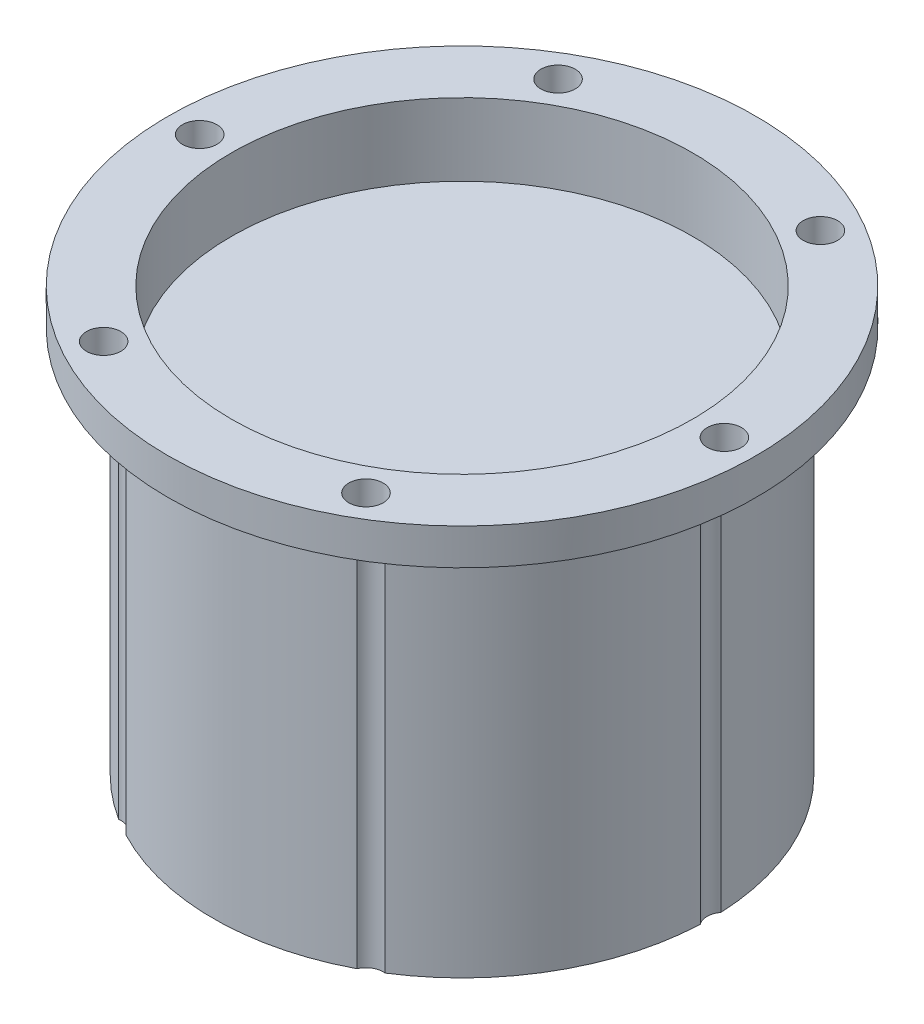
ISO-10303-21;
HEADER;
FILE_DESCRIPTION(('STEP AP214'),'2;1');
FILE_NAME('part.step','',(''),(''),'','','');
FILE_SCHEMA(('AUTOMOTIVE_DESIGN { 1 0 10303 214 1 1 1 1 }'));
ENDSEC;
DATA;
#1=APPLICATION_CONTEXT('core data for automotive mechanical design processes');
#2=APPLICATION_PROTOCOL_DEFINITION('international standard','automotive_design',2000,#1);
#3=PRODUCT_CONTEXT('',#1,'mechanical');
#4=PRODUCT('Part','Part','',(#3));
#5=PRODUCT_RELATED_PRODUCT_CATEGORY('part','',(#4));
#6=PRODUCT_DEFINITION_FORMATION('','',#4);
#7=PRODUCT_DEFINITION_CONTEXT('part definition',#1,'design');
#8=PRODUCT_DEFINITION('design','',#6,#7);
#9=PRODUCT_DEFINITION_SHAPE('','',#8);
#10=(LENGTH_UNIT() NAMED_UNIT(*) SI_UNIT(.MILLI.,.METRE.));
#11=(NAMED_UNIT(*) PLANE_ANGLE_UNIT() SI_UNIT($,.RADIAN.));
#12=(NAMED_UNIT(*) SI_UNIT($,.STERADIAN.) SOLID_ANGLE_UNIT());
#13=UNCERTAINTY_MEASURE_WITH_UNIT(LENGTH_MEASURE(1.E-05),#10,'distance_accuracy_value','');
#14=(GEOMETRIC_REPRESENTATION_CONTEXT(3) GLOBAL_UNCERTAINTY_ASSIGNED_CONTEXT((#13)) GLOBAL_UNIT_ASSIGNED_CONTEXT((#10,
#11,#12)) REPRESENTATION_CONTEXT('',''));
#15=CARTESIAN_POINT('',(0.,0.,0.));
#16=DIRECTION('',(0.,0.,1.));
#17=DIRECTION('',(1.,0.,0.));
#18=AXIS2_PLACEMENT_3D('',#15,#16,#17);
#19=CARTESIAN_POINT('',(0.,-5.07999999999999,0.));
#20=DIRECTION('',(0.,-1.,0.));
#21=DIRECTION('',(0.,0.,-1.));
#22=AXIS2_PLACEMENT_3D('',#19,#20,#21);
#23=CYLINDRICAL_SURFACE('',#22,34.925);
#24=DIRECTION('',(0.,-1.,0.));
#25=VECTOR('',#24,1.);
#26=CARTESIAN_POINT('',(-18.6963691346654,-32.258,29.4991763644399));
#27=LINE('',#26,#25);
#28=CARTESIAN_POINT('',(-18.6963691346653,-59.436,29.49917636444));
#29=VERTEX_POINT('',#28);
#30=CARTESIAN_POINT('',(-18.6963691346653,-5.07999999999999,29.49917636444));
#31=VERTEX_POINT('',#30);
#32=EDGE_CURVE('E55',#29,#31,#27,.F.);
#33=ORIENTED_EDGE('',*,*,#32,.T.);
#34=CARTESIAN_POINT('',(0.,-5.07999999999999,0.));
#35=DIRECTION('',(0.,-1.,0.));
#36=DIRECTION('',(0.,0.,-1.));
#37=AXIS2_PLACEMENT_3D('',#34,#35,#36);
#38=CIRCLE('',#37,34.925);
#39=CARTESIAN_POINT('',(-34.8952206896552,-5.07999999999999,1.44194244693113));
#40=VERTEX_POINT('',#39);
#41=EDGE_CURVE('E164',#31,#40,#38,.T.);
#42=ORIENTED_EDGE('',*,*,#41,.T.);
#43=DIRECTION('',(0.,-1.,0.));
#44=VECTOR('',#43,1.);
#45=CARTESIAN_POINT('',(-34.8952206896552,-32.258,1.44194244693111));
#46=LINE('',#45,#44);
#47=CARTESIAN_POINT('',(-34.8952206896552,-59.436,1.44194244693106));
#48=VERTEX_POINT('',#47);
#49=EDGE_CURVE('E281',#40,#48,#46,.T.);
#50=ORIENTED_EDGE('',*,*,#49,.T.);
#51=CARTESIAN_POINT('',(0.,-59.436,0.));
#52=DIRECTION('',(0.,-1.,0.));
#53=DIRECTION('',(0.,0.,-1.));
#54=AXIS2_PLACEMENT_3D('',#51,#52,#53);
#55=CIRCLE('',#54,34.925);
#56=EDGE_CURVE('E165',#29,#48,#55,.T.);
#57=ORIENTED_EDGE('',*,*,#56,.F.);
#58=EDGE_LOOP('',(#33,#42,#50,#57));
#59=FACE_BOUND('',#58,.T.);
#60=ADVANCED_FACE('F39',(#59),#23,.T.);
#61=DIRECTION('',(0.,-1.,0.));
#62=VECTOR('',#61,1.);
#63=CARTESIAN_POINT('',(-16.1988515549905,-32.258,30.9411188113711));
#64=LINE('',#63,#62);
#65=CARTESIAN_POINT('',(-16.1988515549905,-5.07999999999999,30.9411188113711));
#66=VERTEX_POINT('',#65);
#67=CARTESIAN_POINT('',(-16.1988515549906,-59.436,30.9411188113711));
#68=VERTEX_POINT('',#67);
#69=EDGE_CURVE('E250',#66,#68,#64,.T.);
#70=ORIENTED_EDGE('',*,*,#69,.T.);
#71=CARTESIAN_POINT('',(16.1988515549899,-59.436,30.9411188113714));
#72=VERTEX_POINT('',#71);
#73=EDGE_CURVE('E290',#72,#68,#55,.T.);
#74=ORIENTED_EDGE('',*,*,#73,.F.);
#75=DIRECTION('',(0.,-1.,0.));
#76=VECTOR('',#75,1.);
#77=CARTESIAN_POINT('',(16.1988515549899,-32.258,30.9411188113714));
#78=LINE('',#77,#76);
#79=CARTESIAN_POINT('',(16.1988515549899,-5.07999999999999,30.9411188113714));
#80=VERTEX_POINT('',#79);
#81=EDGE_CURVE('E63',#72,#80,#78,.F.);
#82=ORIENTED_EDGE('',*,*,#81,.T.);
#83=EDGE_CURVE('E183',#80,#66,#38,.T.);
#84=ORIENTED_EDGE('',*,*,#83,.T.);
#85=EDGE_LOOP('',(#70,#74,#82,#84));
#86=FACE_BOUND('',#85,.T.);
#87=ADVANCED_FACE('F332',(#86),#23,.T.);
#88=DIRECTION('',(0.,-1.,0.));
#89=VECTOR('',#88,1.);
#90=CARTESIAN_POINT('',(18.6963691346647,-32.258,29.4991763644403));
#91=LINE('',#90,#89);
#92=CARTESIAN_POINT('',(18.6963691346647,-5.07999999999999,29.4991763644403));
#93=VERTEX_POINT('',#92);
#94=CARTESIAN_POINT('',(18.6963691346647,-59.436,29.4991763644404));
#95=VERTEX_POINT('',#94);
#96=EDGE_CURVE('E233',#93,#95,#91,.T.);
#97=ORIENTED_EDGE('',*,*,#96,.T.);
#98=CARTESIAN_POINT('',(34.8952206896552,-59.436,1.44194244693108));
#99=VERTEX_POINT('',#98);
#100=EDGE_CURVE('E166',#99,#95,#55,.T.);
#101=ORIENTED_EDGE('',*,*,#100,.F.);
#102=DIRECTION('',(0.,-1.,0.));
#103=VECTOR('',#102,1.);
#104=CARTESIAN_POINT('',(34.8952206896552,-32.258,1.44194244693111));
#105=LINE('',#104,#103);
#106=CARTESIAN_POINT('',(34.8952206896552,-5.07999999999999,1.4419424469311));
#107=VERTEX_POINT('',#106);
#108=EDGE_CURVE('E216',#99,#107,#105,.F.);
#109=ORIENTED_EDGE('',*,*,#108,.T.);
#110=EDGE_CURVE('E190',#107,#93,#38,.T.);
#111=ORIENTED_EDGE('',*,*,#110,.T.);
#112=EDGE_LOOP('',(#97,#101,#109,#111));
#113=FACE_BOUND('',#112,.T.);
#114=ADVANCED_FACE('F300',(#113),#23,.T.);
#115=DIRECTION('',(0.,-1.,0.));
#116=VECTOR('',#115,1.);
#117=CARTESIAN_POINT('',(34.8952206896552,-32.258,-1.44194244693111));
#118=LINE('',#117,#116);
#119=CARTESIAN_POINT('',(34.8952206896552,-5.07999999999999,-1.44194244693111));
#120=VERTEX_POINT('',#119);
#121=CARTESIAN_POINT('',(34.8952206896552,-59.436,-1.44194244693106));
#122=VERTEX_POINT('',#121);
#123=EDGE_CURVE('E206',#120,#122,#118,.T.);
#124=ORIENTED_EDGE('',*,*,#123,.T.);
#125=CARTESIAN_POINT('',(18.6963691346651,-59.436,-29.4991763644401));
#126=VERTEX_POINT('',#125);
#127=EDGE_CURVE('E160',#126,#122,#55,.T.);
#128=ORIENTED_EDGE('',*,*,#127,.F.);
#129=DIRECTION('',(0.,-1.,0.));
#130=VECTOR('',#129,1.);
#131=CARTESIAN_POINT('',(18.6963691346651,-32.258,-29.4991763644401));
#132=LINE('',#131,#130);
#133=CARTESIAN_POINT('',(18.6963691346651,-5.07999999999999,-29.4991763644401));
#134=VERTEX_POINT('',#133);
#135=EDGE_CURVE('E135',#126,#134,#132,.F.);
#136=ORIENTED_EDGE('',*,*,#135,.T.);
#137=EDGE_CURVE('E181',#134,#120,#38,.T.);
#138=ORIENTED_EDGE('',*,*,#137,.T.);
#139=EDGE_LOOP('',(#124,#128,#136,#138));
#140=FACE_BOUND('',#139,.T.);
#141=ADVANCED_FACE('F205',(#140),#23,.T.);
#142=DIRECTION('',(0.,-1.,0.));
#143=VECTOR('',#142,1.);
#144=CARTESIAN_POINT('',(16.1988515549903,-32.258,-30.9411188113712));
#145=LINE('',#144,#143);
#146=CARTESIAN_POINT('',(16.1988515549903,-5.07999999999999,-30.9411188113712));
#147=VERTEX_POINT('',#146);
#148=CARTESIAN_POINT('',(16.1988515549903,-59.436,-30.9411188113712));
#149=VERTEX_POINT('',#148);
#150=EDGE_CURVE('E132',#147,#149,#145,.T.);
#151=ORIENTED_EDGE('',*,*,#150,.T.);
#152=CARTESIAN_POINT('',(-16.1988515549901,-59.436,-30.9411188113713));
#153=VERTEX_POINT('',#152);
#154=EDGE_CURVE('E148',#153,#149,#55,.T.);
#155=ORIENTED_EDGE('',*,*,#154,.F.);
#156=DIRECTION('',(0.,-1.,0.));
#157=VECTOR('',#156,1.);
#158=CARTESIAN_POINT('',(-16.1988515549901,-32.258,-30.9411188113713));
#159=LINE('',#158,#157);
#160=CARTESIAN_POINT('',(-16.1988515549901,-5.07999999999999,-30.9411188113713));
#161=VERTEX_POINT('',#160);
#162=EDGE_CURVE('E266',#153,#161,#159,.F.);
#163=ORIENTED_EDGE('',*,*,#162,.T.);
#164=EDGE_CURVE('E150',#161,#147,#38,.T.);
#165=ORIENTED_EDGE('',*,*,#164,.T.);
#166=EDGE_LOOP('',(#151,#155,#163,#165));
#167=FACE_BOUND('',#166,.T.);
#168=ADVANCED_FACE('F146',(#167),#23,.T.);
#169=CARTESIAN_POINT('',(0.,-59.436,0.));
#170=DIRECTION('',(0.,1.,0.));
#171=DIRECTION('',(0.,0.,1.));
#172=AXIS2_PLACEMENT_3D('',#169,#170,#171);
#173=CYLINDRICAL_SURFACE('',#172,41.275);
#174=CARTESIAN_POINT('',(0.,0.,0.));
#175=DIRECTION('',(0.,1.,0.));
#176=DIRECTION('',(0.,0.,1.));
#177=AXIS2_PLACEMENT_3D('',#174,#175,#176);
#178=CIRCLE('',#177,41.275);
#179=CARTESIAN_POINT('',(0.,0.,41.275));
#180=VERTEX_POINT('',#179);
#181=EDGE_CURVE('E11',#180,#180,#178,.T.);
#182=ORIENTED_EDGE('',*,*,#181,.F.);
#183=EDGE_LOOP('',(#182));
#184=FACE_BOUND('',#183,.T.);
#185=CARTESIAN_POINT('',(0.,-5.07999999999999,0.));
#186=DIRECTION('',(0.,-1.,0.));
#187=DIRECTION('',(0.,0.,-1.));
#188=AXIS2_PLACEMENT_3D('',#185,#186,#187);
#189=CIRCLE('',#188,41.275);
#190=CARTESIAN_POINT('',(0.,-5.07999999999999,-41.275));
#191=VERTEX_POINT('',#190);
#192=EDGE_CURVE('E48',#191,#191,#189,.T.);
#193=ORIENTED_EDGE('',*,*,#192,.F.);
#194=EDGE_LOOP('',(#193));
#195=FACE_BOUND('',#194,.T.);
#196=ADVANCED_FACE('F41',(#184,#195),#173,.T.);
#197=CARTESIAN_POINT('',(0.,0.,0.));
#198=DIRECTION('',(0.,1.,0.));
#199=DIRECTION('',(0.,0.,1.));
#200=AXIS2_PLACEMENT_3D('',#197,#198,#199);
#201=PLANE('',#200);
#202=CARTESIAN_POINT('',(0.,0.,0.));
#203=DIRECTION('',(0.,1.,0.));
#204=DIRECTION('',(0.,0.,1.));
#205=AXIS2_PLACEMENT_3D('',#202,#203,#204);
#206=CIRCLE('',#205,32.385);
#207=CARTESIAN_POINT('',(0.,0.,32.385));
#208=VERTEX_POINT('',#207);
#209=EDGE_CURVE('E481',#208,#208,#206,.T.);
#210=ORIENTED_EDGE('',*,*,#209,.F.);
#211=EDGE_LOOP('',(#210));
#212=FACE_BOUND('',#211,.T.);
#213=CARTESIAN_POINT('',(-18.4150000000004,0.,31.8957156213806));
#214=DIRECTION('',(0.,1.,0.));
#215=DIRECTION('',(0.866025403784433,0.,0.50000000000001));
#216=AXIS2_PLACEMENT_3D('',#213,#214,#215);
#217=CIRCLE('',#216,2.413);
#218=CARTESIAN_POINT('',(-16.3252807006685,0.,33.1022156213807));
#219=VERTEX_POINT('',#218);
#220=EDGE_CURVE('E242',#219,#219,#217,.T.);
#221=ORIENTED_EDGE('',*,*,#220,.F.);
#222=EDGE_LOOP('',(#221));
#223=FACE_BOUND('',#222,.T.);
#224=CARTESIAN_POINT('',(18.4149999999997,0.,31.895715621381));
#225=DIRECTION('',(0.,1.,0.));
#226=DIRECTION('',(0.866025403784443,0.,-0.499999999999992));
#227=AXIS2_PLACEMENT_3D('',#224,#225,#226);
#228=CIRCLE('',#227,2.413);
#229=CARTESIAN_POINT('',(20.5047192993316,0.,30.689215621381));
#230=VERTEX_POINT('',#229);
#231=EDGE_CURVE('E225',#230,#230,#228,.T.);
#232=ORIENTED_EDGE('',*,*,#231,.F.);
#233=EDGE_LOOP('',(#232));
#234=FACE_BOUND('',#233,.T.);
#235=CARTESIAN_POINT('',(36.83,0.,0.));
#236=DIRECTION('',(0.,1.,0.));
#237=DIRECTION('',(0.,0.,-1.));
#238=AXIS2_PLACEMENT_3D('',#235,#236,#237);
#239=CIRCLE('',#238,2.413);
#240=CARTESIAN_POINT('',(36.83,0.,-2.413));
#241=VERTEX_POINT('',#240);
#242=EDGE_CURVE('E241',#241,#241,#239,.T.);
#243=ORIENTED_EDGE('',*,*,#242,.F.);
#244=EDGE_LOOP('',(#243));
#245=FACE_BOUND('',#244,.T.);
#246=CARTESIAN_POINT('',(18.4150000000001,0.,-31.8957156213808));
#247=DIRECTION('',(0.,1.,0.));
#248=DIRECTION('',(-0.866025403784436,0.,-0.500000000000004));
#249=AXIS2_PLACEMENT_3D('',#246,#247,#248);
#250=CIRCLE('',#249,2.413);
#251=CARTESIAN_POINT('',(16.3252807006683,0.,-33.1022156213808));
#252=VERTEX_POINT('',#251);
#253=EDGE_CURVE('E141',#252,#252,#250,.T.);
#254=ORIENTED_EDGE('',*,*,#253,.F.);
#255=EDGE_LOOP('',(#254));
#256=FACE_BOUND('',#255,.T.);
#257=CARTESIAN_POINT('',(-18.4149999999999,0.,-31.8957156213809));
#258=DIRECTION('',(0.,1.,0.));
#259=DIRECTION('',(-0.86602540378444,0.,0.499999999999998));
#260=AXIS2_PLACEMENT_3D('',#257,#258,#259);
#261=CIRCLE('',#260,2.413);
#262=CARTESIAN_POINT('',(-20.5047192993318,0.,-30.6892156213809));
#263=VERTEX_POINT('',#262);
#264=EDGE_CURVE('E257',#263,#263,#261,.T.);
#265=ORIENTED_EDGE('',*,*,#264,.F.);
#266=EDGE_LOOP('',(#265));
#267=FACE_BOUND('',#266,.T.);
#268=CARTESIAN_POINT('',(-36.83,0.,0.));
#269=DIRECTION('',(0.,1.,0.));
#270=DIRECTION('',(0.,0.,1.));
#271=AXIS2_PLACEMENT_3D('',#268,#269,#270);
#272=CIRCLE('',#271,2.413);
#273=CARTESIAN_POINT('',(-36.83,0.,2.413));
#274=VERTEX_POINT('',#273);
#275=EDGE_CURVE('E273',#274,#274,#272,.T.);
#276=ORIENTED_EDGE('',*,*,#275,.F.);
#277=EDGE_LOOP('',(#276));
#278=FACE_BOUND('',#277,.T.);
#279=ORIENTED_EDGE('',*,*,#181,.T.);
#280=EDGE_LOOP('',(#279));
#281=FACE_BOUND('',#280,.T.);
#282=ADVANCED_FACE('F317',(#212,#223,#234,#245,#256,#267,#278,#281),#201,.T.);
#283=CARTESIAN_POINT('',(0.,-5.07999999999999,0.));
#284=DIRECTION('',(0.,-1.,0.));
#285=DIRECTION('',(0.,0.,-1.));
#286=AXIS2_PLACEMENT_3D('',#283,#284,#285);
#287=PLANE('',#286);
#288=CARTESIAN_POINT('',(-18.4150000000004,-5.07999999999999,31.8957156213806));
#289=DIRECTION('',(0.,-1.,0.));
#290=DIRECTION('',(0.,0.,-1.));
#291=AXIS2_PLACEMENT_3D('',#288,#289,#290);
#292=CIRCLE('',#291,2.413);
#293=EDGE_CURVE('E230',#31,#66,#292,.F.);
#294=ORIENTED_EDGE('',*,*,#293,.T.);
#295=ORIENTED_EDGE('',*,*,#83,.F.);
#296=CARTESIAN_POINT('',(18.4149999999997,-5.07999999999999,31.895715621381));
#297=DIRECTION('',(0.,-1.,0.));
#298=DIRECTION('',(0.,0.,-1.));
#299=AXIS2_PLACEMENT_3D('',#296,#297,#298);
#300=CIRCLE('',#299,2.413);
#301=EDGE_CURVE('E238',#80,#93,#300,.F.);
#302=ORIENTED_EDGE('',*,*,#301,.T.);
#303=ORIENTED_EDGE('',*,*,#110,.F.);
#304=CARTESIAN_POINT('',(36.83,-5.07999999999999,0.));
#305=DIRECTION('',(0.,-1.,0.));
#306=DIRECTION('',(0.,0.,-1.));
#307=AXIS2_PLACEMENT_3D('',#304,#305,#306);
#308=CIRCLE('',#307,2.413);
#309=EDGE_CURVE('E212',#107,#120,#308,.F.);
#310=ORIENTED_EDGE('',*,*,#309,.T.);
#311=ORIENTED_EDGE('',*,*,#137,.F.);
#312=CARTESIAN_POINT('',(18.4150000000001,-5.07999999999999,-31.8957156213808));
#313=DIRECTION('',(0.,-1.,0.));
#314=DIRECTION('',(0.,0.,-1.));
#315=AXIS2_PLACEMENT_3D('',#312,#313,#314);
#316=CIRCLE('',#315,2.413);
#317=EDGE_CURVE('E211',#134,#147,#316,.F.);
#318=ORIENTED_EDGE('',*,*,#317,.T.);
#319=ORIENTED_EDGE('',*,*,#164,.F.);
#320=CARTESIAN_POINT('',(-18.4149999999999,-5.07999999999999,-31.8957156213809));
#321=DIRECTION('',(0.,-1.,0.));
#322=DIRECTION('',(0.,0.,-1.));
#323=AXIS2_PLACEMENT_3D('',#320,#321,#322);
#324=CIRCLE('',#323,2.413);
#325=CARTESIAN_POINT('',(-18.696369134665,-5.07999999999999,-29.4991763644402));
#326=VERTEX_POINT('',#325);
#327=EDGE_CURVE('E269',#161,#326,#324,.F.);
#328=ORIENTED_EDGE('',*,*,#327,.T.);
#329=CARTESIAN_POINT('',(-34.8952206896552,-5.07999999999999,-1.44194244693112));
#330=VERTEX_POINT('',#329);
#331=EDGE_CURVE('E168',#330,#326,#38,.T.);
#332=ORIENTED_EDGE('',*,*,#331,.F.);
#333=CARTESIAN_POINT('',(-36.83,-5.07999999999999,0.));
#334=DIRECTION('',(0.,-1.,0.));
#335=DIRECTION('',(0.,0.,-1.));
#336=AXIS2_PLACEMENT_3D('',#333,#334,#335);
#337=CIRCLE('',#336,2.413);
#338=EDGE_CURVE('E286',#330,#40,#337,.F.);
#339=ORIENTED_EDGE('',*,*,#338,.T.);
#340=ORIENTED_EDGE('',*,*,#41,.F.);
#341=EDGE_LOOP('',(#294,#295,#302,#303,#310,#311,#318,#319,#328,#332,#339,#340));
#342=FACE_BOUND('',#341,.T.);
#343=ORIENTED_EDGE('',*,*,#192,.T.);
#344=EDGE_LOOP('',(#343));
#345=FACE_BOUND('',#344,.T.);
#346=ADVANCED_FACE('F210',(#342,#345),#287,.T.);
#347=DIRECTION('',(0.,-1.,0.));
#348=VECTOR('',#347,1.);
#349=CARTESIAN_POINT('',(-18.696369134665,-32.258,-29.4991763644402));
#350=LINE('',#349,#348);
#351=CARTESIAN_POINT('',(-18.6963691346649,-59.436,-29.4991763644402));
#352=VERTEX_POINT('',#351);
#353=EDGE_CURVE('E263',#326,#352,#350,.T.);
#354=ORIENTED_EDGE('',*,*,#353,.T.);
#355=CARTESIAN_POINT('',(-34.8952206896552,-59.436,-1.44194244693109));
#356=VERTEX_POINT('',#355);
#357=EDGE_CURVE('E159',#356,#352,#55,.T.);
#358=ORIENTED_EDGE('',*,*,#357,.F.);
#359=DIRECTION('',(0.,-1.,0.));
#360=VECTOR('',#359,1.);
#361=CARTESIAN_POINT('',(-34.8952206896552,-32.258,-1.44194244693111));
#362=LINE('',#361,#360);
#363=EDGE_CURVE('E284',#356,#330,#362,.F.);
#364=ORIENTED_EDGE('',*,*,#363,.T.);
#365=ORIENTED_EDGE('',*,*,#331,.T.);
#366=EDGE_LOOP('',(#354,#358,#364,#365));
#367=FACE_BOUND('',#366,.T.);
#368=ADVANCED_FACE('F309',(#367),#23,.T.);
#369=CARTESIAN_POINT('',(0.,-59.436,0.));
#370=DIRECTION('',(0.,1.,0.));
#371=DIRECTION('',(0.,0.,1.));
#372=AXIS2_PLACEMENT_3D('',#369,#370,#371);
#373=PLANE('',#372);
#374=ORIENTED_EDGE('',*,*,#73,.T.);
#375=CARTESIAN_POINT('',(-18.4150000000004,-59.436,31.8957156213806));
#376=DIRECTION('',(0.,1.,0.));
#377=DIRECTION('',(0.,0.,1.));
#378=AXIS2_PLACEMENT_3D('',#375,#376,#377);
#379=CIRCLE('',#378,2.413);
#380=EDGE_CURVE('E246',#29,#68,#379,.F.);
#381=ORIENTED_EDGE('',*,*,#380,.F.);
#382=ORIENTED_EDGE('',*,*,#56,.T.);
#383=CARTESIAN_POINT('',(-36.83,-59.436,0.));
#384=DIRECTION('',(0.,1.,0.));
#385=DIRECTION('',(0.,0.,1.));
#386=AXIS2_PLACEMENT_3D('',#383,#384,#385);
#387=CIRCLE('',#386,2.413);
#388=EDGE_CURVE('E277',#356,#48,#387,.F.);
#389=ORIENTED_EDGE('',*,*,#388,.F.);
#390=ORIENTED_EDGE('',*,*,#357,.T.);
#391=CARTESIAN_POINT('',(-18.4149999999999,-59.436,-31.8957156213809));
#392=DIRECTION('',(0.,1.,0.));
#393=DIRECTION('',(0.,0.,1.));
#394=AXIS2_PLACEMENT_3D('',#391,#392,#393);
#395=CIRCLE('',#394,2.413);
#396=EDGE_CURVE('E157',#153,#352,#395,.F.);
#397=ORIENTED_EDGE('',*,*,#396,.F.);
#398=ORIENTED_EDGE('',*,*,#154,.T.);
#399=CARTESIAN_POINT('',(18.4150000000001,-59.436,-31.8957156213808));
#400=DIRECTION('',(0.,1.,0.));
#401=DIRECTION('',(0.,0.,1.));
#402=AXIS2_PLACEMENT_3D('',#399,#400,#401);
#403=CIRCLE('',#402,2.413);
#404=EDGE_CURVE('E128',#126,#149,#403,.F.);
#405=ORIENTED_EDGE('',*,*,#404,.F.);
#406=ORIENTED_EDGE('',*,*,#127,.T.);
#407=CARTESIAN_POINT('',(36.83,-59.436,0.));
#408=DIRECTION('',(0.,1.,0.));
#409=DIRECTION('',(0.,0.,1.));
#410=AXIS2_PLACEMENT_3D('',#407,#408,#409);
#411=CIRCLE('',#410,2.413);
#412=EDGE_CURVE('E299',#99,#122,#411,.F.);
#413=ORIENTED_EDGE('',*,*,#412,.F.);
#414=ORIENTED_EDGE('',*,*,#100,.T.);
#415=CARTESIAN_POINT('',(18.4149999999997,-59.436,31.895715621381));
#416=DIRECTION('',(0.,1.,0.));
#417=DIRECTION('',(0.,0.,1.));
#418=AXIS2_PLACEMENT_3D('',#415,#416,#417);
#419=CIRCLE('',#418,2.413);
#420=EDGE_CURVE('E229',#72,#95,#419,.F.);
#421=ORIENTED_EDGE('',*,*,#420,.F.);
#422=EDGE_LOOP('',(#374,#381,#382,#389,#390,#397,#398,#405,#406,#413,#414,#421));
#423=FACE_BOUND('',#422,.T.);
#424=ADVANCED_FACE('F155',(#423),#373,.F.);
#425=CARTESIAN_POINT('',(-36.83,-59.437,0.));
#426=DIRECTION('',(0.,1.,0.));
#427=DIRECTION('',(0.,0.,1.));
#428=AXIS2_PLACEMENT_3D('',#425,#426,#427);
#429=CYLINDRICAL_SURFACE('',#428,2.413);
#430=ORIENTED_EDGE('',*,*,#363,.F.);
#431=ORIENTED_EDGE('',*,*,#388,.T.);
#432=ORIENTED_EDGE('',*,*,#49,.F.);
#433=ORIENTED_EDGE('',*,*,#338,.F.);
#434=EDGE_LOOP('',(#430,#431,#432,#433));
#435=FACE_BOUND('',#434,.T.);
#436=ORIENTED_EDGE('',*,*,#275,.T.);
#437=EDGE_LOOP('',(#436));
#438=FACE_BOUND('',#437,.T.);
#439=ADVANCED_FACE('F306',(#435,#438),#429,.F.);
#440=CARTESIAN_POINT('',(-18.4149999999999,-59.437,-31.8957156213809));
#441=DIRECTION('',(0.,1.,0.));
#442=DIRECTION('',(0.,0.,1.));
#443=AXIS2_PLACEMENT_3D('',#440,#441,#442);
#444=CYLINDRICAL_SURFACE('',#443,2.413);
#445=ORIENTED_EDGE('',*,*,#162,.F.);
#446=ORIENTED_EDGE('',*,*,#396,.T.);
#447=ORIENTED_EDGE('',*,*,#353,.F.);
#448=ORIENTED_EDGE('',*,*,#327,.F.);
#449=EDGE_LOOP('',(#445,#446,#447,#448));
#450=FACE_BOUND('',#449,.T.);
#451=ORIENTED_EDGE('',*,*,#264,.T.);
#452=EDGE_LOOP('',(#451));
#453=FACE_BOUND('',#452,.T.);
#454=ADVANCED_FACE('F311',(#450,#453),#444,.F.);
#455=CARTESIAN_POINT('',(18.4150000000001,-59.437,-31.8957156213808));
#456=DIRECTION('',(0.,1.,0.));
#457=DIRECTION('',(0.,0.,1.));
#458=AXIS2_PLACEMENT_3D('',#455,#456,#457);
#459=CYLINDRICAL_SURFACE('',#458,2.413);
#460=ORIENTED_EDGE('',*,*,#135,.F.);
#461=ORIENTED_EDGE('',*,*,#404,.T.);
#462=ORIENTED_EDGE('',*,*,#150,.F.);
#463=ORIENTED_EDGE('',*,*,#317,.F.);
#464=EDGE_LOOP('',(#460,#461,#462,#463));
#465=FACE_BOUND('',#464,.T.);
#466=ORIENTED_EDGE('',*,*,#253,.T.);
#467=EDGE_LOOP('',(#466));
#468=FACE_BOUND('',#467,.T.);
#469=ADVANCED_FACE('F130',(#465,#468),#459,.F.);
#470=CARTESIAN_POINT('',(36.83,-59.437,0.));
#471=DIRECTION('',(0.,1.,0.));
#472=DIRECTION('',(0.,0.,1.));
#473=AXIS2_PLACEMENT_3D('',#470,#471,#472);
#474=CYLINDRICAL_SURFACE('',#473,2.413);
#475=ORIENTED_EDGE('',*,*,#108,.F.);
#476=ORIENTED_EDGE('',*,*,#412,.T.);
#477=ORIENTED_EDGE('',*,*,#123,.F.);
#478=ORIENTED_EDGE('',*,*,#309,.F.);
#479=EDGE_LOOP('',(#475,#476,#477,#478));
#480=FACE_BOUND('',#479,.T.);
#481=ORIENTED_EDGE('',*,*,#242,.T.);
#482=EDGE_LOOP('',(#481));
#483=FACE_BOUND('',#482,.T.);
#484=ADVANCED_FACE('F385',(#480,#483),#474,.F.);
#485=CARTESIAN_POINT('',(18.4149999999997,-59.437,31.895715621381));
#486=DIRECTION('',(0.,1.,0.));
#487=DIRECTION('',(0.,0.,1.));
#488=AXIS2_PLACEMENT_3D('',#485,#486,#487);
#489=CYLINDRICAL_SURFACE('',#488,2.413);
#490=ORIENTED_EDGE('',*,*,#81,.F.);
#491=ORIENTED_EDGE('',*,*,#420,.T.);
#492=ORIENTED_EDGE('',*,*,#96,.F.);
#493=ORIENTED_EDGE('',*,*,#301,.F.);
#494=EDGE_LOOP('',(#490,#491,#492,#493));
#495=FACE_BOUND('',#494,.T.);
#496=ORIENTED_EDGE('',*,*,#231,.T.);
#497=EDGE_LOOP('',(#496));
#498=FACE_BOUND('',#497,.T.);
#499=ADVANCED_FACE('F301',(#495,#498),#489,.F.);
#500=CARTESIAN_POINT('',(-18.4150000000004,-59.437,31.8957156213806));
#501=DIRECTION('',(0.,1.,0.));
#502=DIRECTION('',(0.,0.,1.));
#503=AXIS2_PLACEMENT_3D('',#500,#501,#502);
#504=CYLINDRICAL_SURFACE('',#503,2.413);
#505=ORIENTED_EDGE('',*,*,#32,.F.);
#506=ORIENTED_EDGE('',*,*,#380,.T.);
#507=ORIENTED_EDGE('',*,*,#69,.F.);
#508=ORIENTED_EDGE('',*,*,#293,.F.);
#509=EDGE_LOOP('',(#505,#506,#507,#508));
#510=FACE_BOUND('',#509,.T.);
#511=ORIENTED_EDGE('',*,*,#220,.T.);
#512=EDGE_LOOP('',(#511));
#513=FACE_BOUND('',#512,.T.);
#514=ADVANCED_FACE('F303',(#510,#513),#504,.F.);
#515=CARTESIAN_POINT('',(0.,-10.16,0.));
#516=DIRECTION('',(0.,1.,0.));
#517=DIRECTION('',(0.,0.,1.));
#518=AXIS2_PLACEMENT_3D('',#515,#516,#517);
#519=CYLINDRICAL_SURFACE('',#518,32.385);
#520=CARTESIAN_POINT('',(0.,-10.16,0.));
#521=DIRECTION('',(0.,1.,0.));
#522=DIRECTION('',(0.,0.,1.));
#523=AXIS2_PLACEMENT_3D('',#520,#521,#522);
#524=CIRCLE('',#523,32.385);
#525=CARTESIAN_POINT('',(0.,-10.16,32.385));
#526=VERTEX_POINT('',#525);
#527=EDGE_CURVE('E247',#526,#526,#524,.T.);
#528=ORIENTED_EDGE('',*,*,#527,.F.);
#529=EDGE_LOOP('',(#528));
#530=FACE_BOUND('',#529,.T.);
#531=ORIENTED_EDGE('',*,*,#209,.T.);
#532=EDGE_LOOP('',(#531));
#533=FACE_BOUND('',#532,.T.);
#534=ADVANCED_FACE('F362',(#530,#533),#519,.F.);
#535=CARTESIAN_POINT('',(0.,-10.16,0.));
#536=DIRECTION('',(0.,1.,0.));
#537=DIRECTION('',(0.,0.,1.));
#538=AXIS2_PLACEMENT_3D('',#535,#536,#537);
#539=PLANE('',#538);
#540=ORIENTED_EDGE('',*,*,#527,.T.);
#541=EDGE_LOOP('',(#540));
#542=FACE_BOUND('',#541,.T.);
#543=ADVANCED_FACE('F367',(#542),#539,.T.);
#544=CLOSED_SHELL('',(#60,#87,#114,#141,#168,#196,#282,#346,#368,#424,#439,#454,#469,#484,#499,
#514,#534,#543));
#545=MANIFOLD_SOLID_BREP('B2',#544);
#546=ADVANCED_BREP_SHAPE_REPRESENTATION('',(#18,#545),#14);
#547=SHAPE_DEFINITION_REPRESENTATION(#9,#546);
ENDSEC;
END-ISO-10303-21;
